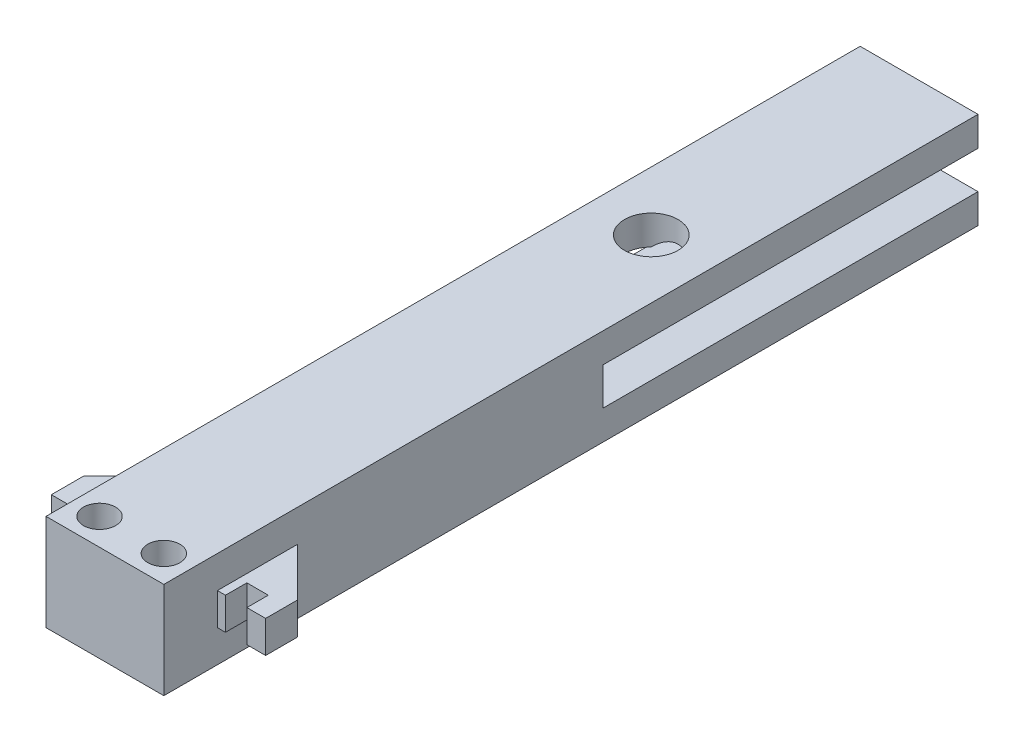
ISO-10303-21;
HEADER;
FILE_DESCRIPTION(('STEP AP214'),'2;1');
FILE_NAME('part.step','',(''),(''),'','','');
FILE_SCHEMA(('AUTOMOTIVE_DESIGN { 1 0 10303 214 1 1 1 1 }'));
ENDSEC;
DATA;
#1=APPLICATION_CONTEXT('core data for automotive mechanical design processes');
#2=APPLICATION_PROTOCOL_DEFINITION('international standard','automotive_design',2000,#1);
#3=PRODUCT_CONTEXT('',#1,'mechanical');
#4=PRODUCT('Part','Part','',(#3));
#5=PRODUCT_RELATED_PRODUCT_CATEGORY('part','',(#4));
#6=PRODUCT_DEFINITION_FORMATION('','',#4);
#7=PRODUCT_DEFINITION_CONTEXT('part definition',#1,'design');
#8=PRODUCT_DEFINITION('design','',#6,#7);
#9=PRODUCT_DEFINITION_SHAPE('','',#8);
#10=(LENGTH_UNIT() NAMED_UNIT(*) SI_UNIT(.MILLI.,.METRE.));
#11=(NAMED_UNIT(*) PLANE_ANGLE_UNIT() SI_UNIT($,.RADIAN.));
#12=(NAMED_UNIT(*) SI_UNIT($,.STERADIAN.) SOLID_ANGLE_UNIT());
#13=UNCERTAINTY_MEASURE_WITH_UNIT(LENGTH_MEASURE(1.E-05),#10,'distance_accuracy_value','');
#14=(GEOMETRIC_REPRESENTATION_CONTEXT(3) GLOBAL_UNCERTAINTY_ASSIGNED_CONTEXT((#13)) GLOBAL_UNIT_ASSIGNED_CONTEXT((#10,
#11,#12)) REPRESENTATION_CONTEXT('',''));
#15=CARTESIAN_POINT('',(0.,0.,0.));
#16=DIRECTION('',(0.,0.,1.));
#17=DIRECTION('',(1.,0.,0.));
#18=AXIS2_PLACEMENT_3D('',#15,#16,#17);
#19=CARTESIAN_POINT('',(0.,4.5,-42.9999999999999));
#20=DIRECTION('',(0.,0.,1.));
#21=DIRECTION('',(1.,0.,0.));
#22=AXIS2_PLACEMENT_3D('',#19,#20,#21);
#23=CYLINDRICAL_SURFACE('',#22,2.5);
#24=CARTESIAN_POINT('',(0.,4.5,-13.));
#25=DIRECTION('',(0.,0.707106781186547,0.707106781186547));
#26=DIRECTION('',(0.,0.707106781186547,-0.707106781186547));
#27=AXIS2_PLACEMENT_3D('',#24,#25,#26);
#28=ELLIPSE('',#27,3.53553390593274,2.5);
#29=CARTESIAN_POINT('',(1.78535710713579,6.24999999999992,-14.7499999999999));
#30=VERTEX_POINT('',#29);
#31=CARTESIAN_POINT('',(-1.78535710713579,6.24999999999992,-14.7499999999999));
#32=VERTEX_POINT('',#31);
#33=EDGE_CURVE('E62',#30,#32,#28,.T.);
#34=ORIENTED_EDGE('',*,*,#33,.T.);
#35=DIRECTION('',(0.,0.,1.));
#36=VECTOR('',#35,1.);
#37=CARTESIAN_POINT('',(-1.78535710713579,6.24999999999992,-42.9999999999999));
#38=LINE('',#37,#36);
#39=CARTESIAN_POINT('',(-1.78535710713579,6.24999999999992,-38.));
#40=VERTEX_POINT('',#39);
#41=EDGE_CURVE('E256',#40,#32,#38,.T.);
#42=ORIENTED_EDGE('',*,*,#41,.F.);
#43=CARTESIAN_POINT('',(0.,4.5,-38.));
#44=DIRECTION('',(0.,0.,1.));
#45=DIRECTION('',(1.,0.,0.));
#46=AXIS2_PLACEMENT_3D('',#43,#44,#45);
#47=CIRCLE('',#46,2.5);
#48=CARTESIAN_POINT('',(1.78535710713579,6.24999999999992,-38.));
#49=VERTEX_POINT('',#48);
#50=EDGE_CURVE('E342',#49,#40,#47,.T.);
#51=ORIENTED_EDGE('',*,*,#50,.F.);
#52=DIRECTION('',(0.,0.,1.));
#53=VECTOR('',#52,1.);
#54=CARTESIAN_POINT('',(1.78535710713579,6.24999999999992,-42.9999999999999));
#55=LINE('',#54,#53);
#56=EDGE_CURVE('E258',#30,#49,#55,.F.);
#57=ORIENTED_EDGE('',*,*,#56,.F.);
#58=EDGE_LOOP('',(#34,#42,#51,#57));
#59=FACE_BOUND('',#58,.T.);
#60=ADVANCED_FACE('F46',(#59),#23,.F.);
#61=CARTESIAN_POINT('',(-5.5,9.,-38.));
#62=DIRECTION('',(0.,0.,1.));
#63=DIRECTION('',(1.,0.,0.));
#64=AXIS2_PLACEMENT_3D('',#61,#62,#63);
#65=PLANE('',#64);
#66=DIRECTION('',(0.,-1.,0.));
#67=VECTOR('',#66,1.);
#68=CARTESIAN_POINT('',(-5.5,9.,-38.));
#69=LINE('',#68,#67);
#70=CARTESIAN_POINT('',(-5.5,2.75000000000008,-38.));
#71=VERTEX_POINT('',#70);
#72=CARTESIAN_POINT('',(-5.5,0.,-38.));
#73=VERTEX_POINT('',#72);
#74=EDGE_CURVE('E302',#71,#73,#69,.T.);
#75=ORIENTED_EDGE('',*,*,#74,.F.);
#76=DIRECTION('',(-1.,0.,0.));
#77=VECTOR('',#76,1.);
#78=CARTESIAN_POINT('',(5.5,2.75000000000008,-38.));
#79=LINE('',#78,#77);
#80=CARTESIAN_POINT('',(-1.78535710713579,2.75000000000008,-38.));
#81=VERTEX_POINT('',#80);
#82=EDGE_CURVE('E539',#81,#71,#79,.T.);
#83=ORIENTED_EDGE('',*,*,#82,.F.);
#84=CARTESIAN_POINT('',(1.78535710713579,2.75000000000008,-38.));
#85=VERTEX_POINT('',#84);
#86=EDGE_CURVE('E345',#81,#85,#47,.T.);
#87=ORIENTED_EDGE('',*,*,#86,.T.);
#88=CARTESIAN_POINT('',(5.5,2.75000000000008,-38.));
#89=VERTEX_POINT('',#88);
#90=EDGE_CURVE('E535',#89,#85,#79,.T.);
#91=ORIENTED_EDGE('',*,*,#90,.F.);
#92=DIRECTION('',(0.,-1.,0.));
#93=VECTOR('',#92,1.);
#94=CARTESIAN_POINT('',(5.5,9.,-38.));
#95=LINE('',#94,#93);
#96=CARTESIAN_POINT('',(5.5,0.,-38.));
#97=VERTEX_POINT('',#96);
#98=EDGE_CURVE('E293',#89,#97,#95,.T.);
#99=ORIENTED_EDGE('',*,*,#98,.T.);
#100=DIRECTION('',(-1.,0.,0.));
#101=VECTOR('',#100,1.);
#102=CARTESIAN_POINT('',(-5.5,0.,-38.));
#103=LINE('',#102,#101);
#104=EDGE_CURVE('E319',#97,#73,#103,.T.);
#105=ORIENTED_EDGE('',*,*,#104,.T.);
#106=EDGE_LOOP('',(#75,#83,#87,#91,#99,#105));
#107=FACE_BOUND('',#106,.T.);
#108=ADVANCED_FACE('F617',(#107),#65,.F.);
#109=CARTESIAN_POINT('',(10.,6.,33.));
#110=DIRECTION('',(0.,0.,1.));
#111=DIRECTION('',(1.,0.,0.));
#112=AXIS2_PLACEMENT_3D('',#109,#110,#111);
#113=PLANE('',#112);
#114=DIRECTION('',(-1.,0.,0.));
#115=VECTOR('',#114,1.);
#116=CARTESIAN_POINT('',(10.,6.,33.));
#117=LINE('',#116,#115);
#118=CARTESIAN_POINT('',(10.,6.,33.));
#119=VERTEX_POINT('',#118);
#120=CARTESIAN_POINT('',(8.25,6.,33.));
#121=VERTEX_POINT('',#120);
#122=EDGE_CURVE('E395',#119,#121,#117,.T.);
#123=ORIENTED_EDGE('',*,*,#122,.T.);
#124=DIRECTION('',(0.,-1.,0.));
#125=VECTOR('',#124,1.);
#126=CARTESIAN_POINT('',(8.25,6.,33.));
#127=LINE('',#126,#125);
#128=CARTESIAN_POINT('',(8.25,3.,33.));
#129=VERTEX_POINT('',#128);
#130=EDGE_CURVE('E473',#121,#129,#127,.T.);
#131=ORIENTED_EDGE('',*,*,#130,.T.);
#132=DIRECTION('',(-1.,0.,0.));
#133=VECTOR('',#132,1.);
#134=CARTESIAN_POINT('',(10.,3.,33.));
#135=LINE('',#134,#133);
#136=CARTESIAN_POINT('',(10.,3.,33.));
#137=VERTEX_POINT('',#136);
#138=EDGE_CURVE('E376',#137,#129,#135,.T.);
#139=ORIENTED_EDGE('',*,*,#138,.F.);
#140=DIRECTION('',(0.,1.,0.));
#141=VECTOR('',#140,1.);
#142=CARTESIAN_POINT('',(10.,6.,33.));
#143=LINE('',#142,#141);
#144=EDGE_CURVE('E403',#137,#119,#143,.T.);
#145=ORIENTED_EDGE('',*,*,#144,.T.);
#146=EDGE_LOOP('',(#123,#131,#139,#145));
#147=FACE_BOUND('',#146,.T.);
#148=ADVANCED_FACE('F658',(#147),#113,.T.);
#149=CARTESIAN_POINT('',(6.25,3.,33.));
#150=VERTEX_POINT('',#149);
#151=CARTESIAN_POINT('',(5.5,3.,33.));
#152=VERTEX_POINT('',#151);
#153=EDGE_CURVE('E394',#150,#152,#135,.T.);
#154=ORIENTED_EDGE('',*,*,#153,.F.);
#155=DIRECTION('',(0.,1.,0.));
#156=VECTOR('',#155,1.);
#157=CARTESIAN_POINT('',(6.25,6.,33.));
#158=LINE('',#157,#156);
#159=CARTESIAN_POINT('',(6.25,6.,33.));
#160=VERTEX_POINT('',#159);
#161=EDGE_CURVE('E485',#150,#160,#158,.T.);
#162=ORIENTED_EDGE('',*,*,#161,.T.);
#163=CARTESIAN_POINT('',(5.5,6.,33.));
#164=VERTEX_POINT('',#163);
#165=EDGE_CURVE('E399',#160,#164,#117,.T.);
#166=ORIENTED_EDGE('',*,*,#165,.T.);
#167=DIRECTION('',(0.,1.,0.));
#168=VECTOR('',#167,1.);
#169=CARTESIAN_POINT('',(5.5,6.,33.));
#170=LINE('',#169,#168);
#171=EDGE_CURVE('E408',#152,#164,#170,.T.);
#172=ORIENTED_EDGE('',*,*,#171,.F.);
#173=EDGE_LOOP('',(#154,#162,#166,#172));
#174=FACE_BOUND('',#173,.T.);
#175=ADVANCED_FACE('F730',(#174),#113,.T.);
#176=CARTESIAN_POINT('',(10.,3.,30.));
#177=DIRECTION('',(0.,-1.,0.));
#178=DIRECTION('',(0.,0.,-1.));
#179=AXIS2_PLACEMENT_3D('',#176,#177,#178);
#180=PLANE('',#179);
#181=ORIENTED_EDGE('',*,*,#138,.T.);
#182=DIRECTION('',(0.,0.,1.));
#183=VECTOR('',#182,1.);
#184=CARTESIAN_POINT('',(8.25,3.,26.394448724536));
#185=LINE('',#184,#183);
#186=CARTESIAN_POINT('',(8.25,3.,31.));
#187=VERTEX_POINT('',#186);
#188=EDGE_CURVE('E472',#187,#129,#185,.T.);
#189=ORIENTED_EDGE('',*,*,#188,.F.);
#190=DIRECTION('',(1.,0.,0.));
#191=VECTOR('',#190,1.);
#192=CARTESIAN_POINT('',(8.25,3.,31.));
#193=LINE('',#192,#191);
#194=CARTESIAN_POINT('',(6.25,3.,31.));
#195=VERTEX_POINT('',#194);
#196=EDGE_CURVE('E462',#195,#187,#193,.T.);
#197=ORIENTED_EDGE('',*,*,#196,.F.);
#198=DIRECTION('',(0.,0.,1.));
#199=VECTOR('',#198,1.);
#200=CARTESIAN_POINT('',(6.25,3.,26.394448724536));
#201=LINE('',#200,#199);
#202=EDGE_CURVE('E468',#195,#150,#201,.T.);
#203=ORIENTED_EDGE('',*,*,#202,.T.);
#204=ORIENTED_EDGE('',*,*,#153,.T.);
#205=DIRECTION('',(0.,0.,1.));
#206=VECTOR('',#205,1.);
#207=CARTESIAN_POINT('',(5.5,3.,30.));
#208=LINE('',#207,#206);
#209=CARTESIAN_POINT('',(5.5,3.,25.5));
#210=VERTEX_POINT('',#209);
#211=EDGE_CURVE('E404',#210,#152,#208,.T.);
#212=ORIENTED_EDGE('',*,*,#211,.F.);
#213=DIRECTION('',(-0.707106781186546,0.,-0.707106781186549));
#214=VECTOR('',#213,1.);
#215=CARTESIAN_POINT('',(10.,3.,30.));
#216=LINE('',#215,#214);
#217=CARTESIAN_POINT('',(10.,3.,30.));
#218=VERTEX_POINT('',#217);
#219=EDGE_CURVE('E506',#218,#210,#216,.T.);
#220=ORIENTED_EDGE('',*,*,#219,.F.);
#221=DIRECTION('',(0.,0.,1.));
#222=VECTOR('',#221,1.);
#223=CARTESIAN_POINT('',(10.,3.,30.));
#224=LINE('',#223,#222);
#225=EDGE_CURVE('E421',#218,#137,#224,.T.);
#226=ORIENTED_EDGE('',*,*,#225,.T.);
#227=EDGE_LOOP('',(#181,#189,#197,#203,#204,#212,#220,#226));
#228=FACE_BOUND('',#227,.T.);
#229=ADVANCED_FACE('F688',(#228),#180,.T.);
#230=CARTESIAN_POINT('',(10.,6.,30.));
#231=DIRECTION('',(0.,1.,0.));
#232=DIRECTION('',(0.,0.,1.));
#233=AXIS2_PLACEMENT_3D('',#230,#231,#232);
#234=PLANE('',#233);
#235=DIRECTION('',(-1.,0.,0.));
#236=VECTOR('',#235,1.);
#237=CARTESIAN_POINT('',(8.25,6.,31.));
#238=LINE('',#237,#236);
#239=CARTESIAN_POINT('',(8.25,6.,31.));
#240=VERTEX_POINT('',#239);
#241=CARTESIAN_POINT('',(6.25,6.,31.));
#242=VERTEX_POINT('',#241);
#243=EDGE_CURVE('E492',#240,#242,#238,.T.);
#244=ORIENTED_EDGE('',*,*,#243,.F.);
#245=DIRECTION('',(0.,0.,1.));
#246=VECTOR('',#245,1.);
#247=CARTESIAN_POINT('',(8.25,6.,26.394448724536));
#248=LINE('',#247,#246);
#249=EDGE_CURVE('E476',#240,#121,#248,.T.);
#250=ORIENTED_EDGE('',*,*,#249,.T.);
#251=ORIENTED_EDGE('',*,*,#122,.F.);
#252=DIRECTION('',(0.,0.,-1.));
#253=VECTOR('',#252,1.);
#254=CARTESIAN_POINT('',(10.,6.,30.));
#255=LINE('',#254,#253);
#256=CARTESIAN_POINT('',(10.,6.,30.));
#257=VERTEX_POINT('',#256);
#258=EDGE_CURVE('E413',#119,#257,#255,.T.);
#259=ORIENTED_EDGE('',*,*,#258,.T.);
#260=DIRECTION('',(0.707106781186546,0.,0.707106781186549));
#261=VECTOR('',#260,1.);
#262=CARTESIAN_POINT('',(10.,6.,30.));
#263=LINE('',#262,#261);
#264=CARTESIAN_POINT('',(5.5,6.,25.5));
#265=VERTEX_POINT('',#264);
#266=EDGE_CURVE('E517',#265,#257,#263,.T.);
#267=ORIENTED_EDGE('',*,*,#266,.F.);
#268=DIRECTION('',(0.,0.,-1.));
#269=VECTOR('',#268,1.);
#270=CARTESIAN_POINT('',(5.5,6.,30.));
#271=LINE('',#270,#269);
#272=EDGE_CURVE('E400',#164,#265,#271,.T.);
#273=ORIENTED_EDGE('',*,*,#272,.F.);
#274=ORIENTED_EDGE('',*,*,#165,.F.);
#275=DIRECTION('',(0.,0.,1.));
#276=VECTOR('',#275,1.);
#277=CARTESIAN_POINT('',(6.25,6.,26.394448724536));
#278=LINE('',#277,#276);
#279=EDGE_CURVE('E467',#242,#160,#278,.T.);
#280=ORIENTED_EDGE('',*,*,#279,.F.);
#281=EDGE_LOOP('',(#244,#250,#251,#259,#267,#273,#274,#280));
#282=FACE_BOUND('',#281,.T.);
#283=ADVANCED_FACE('F681',(#282),#234,.T.);
#284=CARTESIAN_POINT('',(-9.99999999999999,6.,33.));
#285=DIRECTION('',(0.,0.,-1.));
#286=DIRECTION('',(-1.,0.,0.));
#287=AXIS2_PLACEMENT_3D('',#284,#285,#286);
#288=PLANE('',#287);
#289=DIRECTION('',(1.,0.,0.));
#290=VECTOR('',#289,1.);
#291=CARTESIAN_POINT('',(-9.99999999999999,6.,33.));
#292=LINE('',#291,#290);
#293=CARTESIAN_POINT('',(-6.24999999999999,6.,33.));
#294=VERTEX_POINT('',#293);
#295=CARTESIAN_POINT('',(-5.49999999999999,6.,33.));
#296=VERTEX_POINT('',#295);
#297=EDGE_CURVE('E358',#294,#296,#292,.T.);
#298=ORIENTED_EDGE('',*,*,#297,.F.);
#299=DIRECTION('',(0.,1.,0.));
#300=VECTOR('',#299,1.);
#301=CARTESIAN_POINT('',(-6.24999999999999,6.,33.));
#302=LINE('',#301,#300);
#303=CARTESIAN_POINT('',(-6.24999999999999,3.,33.));
#304=VERTEX_POINT('',#303);
#305=EDGE_CURVE('E450',#304,#294,#302,.T.);
#306=ORIENTED_EDGE('',*,*,#305,.F.);
#307=DIRECTION('',(1.,0.,0.));
#308=VECTOR('',#307,1.);
#309=CARTESIAN_POINT('',(-9.99999999999999,3.,33.));
#310=LINE('',#309,#308);
#311=CARTESIAN_POINT('',(-5.49999999999999,3.,33.));
#312=VERTEX_POINT('',#311);
#313=EDGE_CURVE('E363',#304,#312,#310,.T.);
#314=ORIENTED_EDGE('',*,*,#313,.T.);
#315=DIRECTION('',(0.,1.,0.));
#316=VECTOR('',#315,1.);
#317=CARTESIAN_POINT('',(-5.49999999999999,6.,33.));
#318=LINE('',#317,#316);
#319=EDGE_CURVE('E372',#312,#296,#318,.T.);
#320=ORIENTED_EDGE('',*,*,#319,.T.);
#321=EDGE_LOOP('',(#298,#306,#314,#320));
#322=FACE_BOUND('',#321,.T.);
#323=ADVANCED_FACE('F671',(#322),#288,.F.);
#324=CARTESIAN_POINT('',(-5.5,9.,-38.));
#325=DIRECTION('',(1.,0.,0.));
#326=DIRECTION('',(0.,0.,-1.));
#327=AXIS2_PLACEMENT_3D('',#324,#325,#326);
#328=PLANE('',#327);
#329=DIRECTION('',(0.,1.,0.));
#330=VECTOR('',#329,1.);
#331=CARTESIAN_POINT('',(-5.5,6.24999999999992,-2.99999999999999));
#332=LINE('',#331,#330);
#333=CARTESIAN_POINT('',(-5.5,2.75000000000008,-2.99999999999999));
#334=VERTEX_POINT('',#333);
#335=CARTESIAN_POINT('',(-5.5,6.24999999999992,-2.99999999999999));
#336=VERTEX_POINT('',#335);
#337=EDGE_CURVE('E538',#334,#336,#332,.T.);
#338=ORIENTED_EDGE('',*,*,#337,.F.);
#339=DIRECTION('',(0.,0.,-1.));
#340=VECTOR('',#339,1.);
#341=CARTESIAN_POINT('',(-5.5,2.75000000000008,-2.99999999999999));
#342=LINE('',#341,#340);
#343=EDGE_CURVE('E521',#334,#71,#342,.T.);
#344=ORIENTED_EDGE('',*,*,#343,.T.);
#345=ORIENTED_EDGE('',*,*,#74,.T.);
#346=DIRECTION('',(0.,0.,1.));
#347=VECTOR('',#346,1.);
#348=CARTESIAN_POINT('',(-5.5,0.,-38.));
#349=LINE('',#348,#347);
#350=CARTESIAN_POINT('',(-5.49999999999999,0.,38.));
#351=VERTEX_POINT('',#350);
#352=EDGE_CURVE('E316',#73,#351,#349,.T.);
#353=ORIENTED_EDGE('',*,*,#352,.T.);
#354=DIRECTION('',(0.,-1.,0.));
#355=VECTOR('',#354,1.);
#356=CARTESIAN_POINT('',(-5.49999999999999,9.,38.));
#357=LINE('',#356,#355);
#358=CARTESIAN_POINT('',(-5.49999999999999,9.,38.));
#359=VERTEX_POINT('',#358);
#360=EDGE_CURVE('E303',#359,#351,#357,.T.);
#361=ORIENTED_EDGE('',*,*,#360,.F.);
#362=DIRECTION('',(0.,0.,1.));
#363=VECTOR('',#362,1.);
#364=CARTESIAN_POINT('',(-5.5,9.,-38.));
#365=LINE('',#364,#363);
#366=CARTESIAN_POINT('',(-5.5,9.,-38.));
#367=VERTEX_POINT('',#366);
#368=EDGE_CURVE('E330',#367,#359,#365,.T.);
#369=ORIENTED_EDGE('',*,*,#368,.F.);
#370=CARTESIAN_POINT('',(-5.5,6.24999999999992,-38.));
#371=VERTEX_POINT('',#370);
#372=EDGE_CURVE('E297',#367,#371,#69,.T.);
#373=ORIENTED_EDGE('',*,*,#372,.T.);
#374=DIRECTION('',(0.,0.,-1.));
#375=VECTOR('',#374,1.);
#376=CARTESIAN_POINT('',(-5.5,6.24999999999992,-2.99999999999999));
#377=LINE('',#376,#375);
#378=EDGE_CURVE('E522',#336,#371,#377,.T.);
#379=ORIENTED_EDGE('',*,*,#378,.F.);
#380=EDGE_LOOP('',(#338,#344,#345,#353,#361,#369,#373,#379));
#381=FACE_BOUND('',#380,.T.);
#382=DIRECTION('',(0.,1.,0.));
#383=VECTOR('',#382,1.);
#384=CARTESIAN_POINT('',(-5.5,-3.36396103067894,25.5));
#385=LINE('',#384,#383);
#386=CARTESIAN_POINT('',(-5.5,3.,25.5));
#387=VERTEX_POINT('',#386);
#388=CARTESIAN_POINT('',(-5.5,6.,25.5));
#389=VERTEX_POINT('',#388);
#390=EDGE_CURVE('E498',#387,#389,#385,.T.);
#391=ORIENTED_EDGE('',*,*,#390,.T.);
#392=DIRECTION('',(0.,0.,-1.));
#393=VECTOR('',#392,1.);
#394=CARTESIAN_POINT('',(-5.49999999999999,6.,30.));
#395=LINE('',#394,#393);
#396=EDGE_CURVE('E369',#296,#389,#395,.T.);
#397=ORIENTED_EDGE('',*,*,#396,.F.);
#398=ORIENTED_EDGE('',*,*,#319,.F.);
#399=DIRECTION('',(0.,0.,1.));
#400=VECTOR('',#399,1.);
#401=CARTESIAN_POINT('',(-5.49999999999999,3.,30.));
#402=LINE('',#401,#400);
#403=EDGE_CURVE('E364',#387,#312,#402,.T.);
#404=ORIENTED_EDGE('',*,*,#403,.F.);
#405=EDGE_LOOP('',(#391,#397,#398,#404));
#406=FACE_BOUND('',#405,.T.);
#407=ADVANCED_FACE('F610',(#381,#406),#328,.F.);
#408=CARTESIAN_POINT('',(5.5,9.,-38.));
#409=DIRECTION('',(-1.,0.,0.));
#410=DIRECTION('',(0.,0.,1.));
#411=AXIS2_PLACEMENT_3D('',#408,#409,#410);
#412=PLANE('',#411);
#413=ORIENTED_EDGE('',*,*,#98,.F.);
#414=DIRECTION('',(0.,0.,-1.));
#415=VECTOR('',#414,1.);
#416=CARTESIAN_POINT('',(5.5,2.75000000000008,-2.99999999999999));
#417=LINE('',#416,#415);
#418=CARTESIAN_POINT('',(5.5,2.75000000000008,-2.99999999999999));
#419=VERTEX_POINT('',#418);
#420=EDGE_CURVE('E529',#419,#89,#417,.T.);
#421=ORIENTED_EDGE('',*,*,#420,.F.);
#422=DIRECTION('',(0.,-1.,0.));
#423=VECTOR('',#422,1.);
#424=CARTESIAN_POINT('',(5.5,6.24999999999992,-2.99999999999999));
#425=LINE('',#424,#423);
#426=CARTESIAN_POINT('',(5.5,6.24999999999992,-2.99999999999999));
#427=VERTEX_POINT('',#426);
#428=EDGE_CURVE('E545',#427,#419,#425,.T.);
#429=ORIENTED_EDGE('',*,*,#428,.F.);
#430=DIRECTION('',(0.,0.,-1.));
#431=VECTOR('',#430,1.);
#432=CARTESIAN_POINT('',(5.5,6.24999999999992,-2.99999999999999));
#433=LINE('',#432,#431);
#434=CARTESIAN_POINT('',(5.5,6.24999999999992,-38.));
#435=VERTEX_POINT('',#434);
#436=EDGE_CURVE('E525',#427,#435,#433,.T.);
#437=ORIENTED_EDGE('',*,*,#436,.T.);
#438=CARTESIAN_POINT('',(5.5,9.,-38.));
#439=VERTEX_POINT('',#438);
#440=EDGE_CURVE('E289',#439,#435,#95,.T.);
#441=ORIENTED_EDGE('',*,*,#440,.F.);
#442=DIRECTION('',(0.,0.,-1.));
#443=VECTOR('',#442,1.);
#444=CARTESIAN_POINT('',(5.5,9.,-38.));
#445=LINE('',#444,#443);
#446=CARTESIAN_POINT('',(5.5,9.,38.));
#447=VERTEX_POINT('',#446);
#448=EDGE_CURVE('E315',#447,#439,#445,.T.);
#449=ORIENTED_EDGE('',*,*,#448,.F.);
#450=DIRECTION('',(0.,-1.,0.));
#451=VECTOR('',#450,1.);
#452=CARTESIAN_POINT('',(5.5,9.,38.));
#453=LINE('',#452,#451);
#454=CARTESIAN_POINT('',(5.5,0.,38.));
#455=VERTEX_POINT('',#454);
#456=EDGE_CURVE('E307',#447,#455,#453,.T.);
#457=ORIENTED_EDGE('',*,*,#456,.T.);
#458=DIRECTION('',(0.,0.,-1.));
#459=VECTOR('',#458,1.);
#460=CARTESIAN_POINT('',(5.5,0.,-38.));
#461=LINE('',#460,#459);
#462=EDGE_CURVE('E323',#455,#97,#461,.T.);
#463=ORIENTED_EDGE('',*,*,#462,.T.);
#464=EDGE_LOOP('',(#413,#421,#429,#437,#441,#449,#457,#463));
#465=FACE_BOUND('',#464,.T.);
#466=ORIENTED_EDGE('',*,*,#272,.T.);
#467=DIRECTION('',(0.,1.,0.));
#468=VECTOR('',#467,1.);
#469=CARTESIAN_POINT('',(5.50000000000001,-3.36396103067894,25.5));
#470=LINE('',#469,#468);
#471=EDGE_CURVE('E513',#210,#265,#470,.T.);
#472=ORIENTED_EDGE('',*,*,#471,.F.);
#473=ORIENTED_EDGE('',*,*,#211,.T.);
#474=ORIENTED_EDGE('',*,*,#171,.T.);
#475=EDGE_LOOP('',(#466,#472,#473,#474));
#476=FACE_BOUND('',#475,.T.);
#477=ADVANCED_FACE('F48',(#465,#476),#412,.F.);
#478=ORIENTED_EDGE('',*,*,#440,.T.);
#479=DIRECTION('',(1.,0.,0.));
#480=VECTOR('',#479,1.);
#481=CARTESIAN_POINT('',(5.5,6.24999999999992,-38.));
#482=LINE('',#481,#480);
#483=EDGE_CURVE('E260',#49,#435,#482,.T.);
#484=ORIENTED_EDGE('',*,*,#483,.F.);
#485=ORIENTED_EDGE('',*,*,#50,.T.);
#486=EDGE_CURVE('E264',#371,#40,#482,.T.);
#487=ORIENTED_EDGE('',*,*,#486,.F.);
#488=ORIENTED_EDGE('',*,*,#372,.F.);
#489=DIRECTION('',(-1.,0.,0.));
#490=VECTOR('',#489,1.);
#491=CARTESIAN_POINT('',(-5.5,9.,-38.));
#492=LINE('',#491,#490);
#493=EDGE_CURVE('E333',#439,#367,#492,.T.);
#494=ORIENTED_EDGE('',*,*,#493,.F.);
#495=EDGE_LOOP('',(#478,#484,#485,#487,#488,#494));
#496=FACE_BOUND('',#495,.T.);
#497=ADVANCED_FACE('F642',(#496),#65,.F.);
#498=CARTESIAN_POINT('',(-5.49999999999999,9.,38.));
#499=DIRECTION('',(0.,0.,-1.));
#500=DIRECTION('',(-1.,0.,0.));
#501=AXIS2_PLACEMENT_3D('',#498,#499,#500);
#502=PLANE('',#501);
#503=DIRECTION('',(1.,0.,0.));
#504=VECTOR('',#503,1.);
#505=CARTESIAN_POINT('',(-5.49999999999999,0.,38.));
#506=LINE('',#505,#504);
#507=EDGE_CURVE('E312',#351,#455,#506,.T.);
#508=ORIENTED_EDGE('',*,*,#507,.T.);
#509=ORIENTED_EDGE('',*,*,#456,.F.);
#510=DIRECTION('',(1.,0.,0.));
#511=VECTOR('',#510,1.);
#512=CARTESIAN_POINT('',(-5.49999999999999,9.,38.));
#513=LINE('',#512,#511);
#514=EDGE_CURVE('E311',#359,#447,#513,.T.);
#515=ORIENTED_EDGE('',*,*,#514,.F.);
#516=ORIENTED_EDGE('',*,*,#360,.T.);
#517=EDGE_LOOP('',(#508,#509,#515,#516));
#518=FACE_BOUND('',#517,.T.);
#519=ADVANCED_FACE('F605',(#518),#502,.F.);
#520=CARTESIAN_POINT('',(0.,9.,0.));
#521=DIRECTION('',(0.,1.,0.));
#522=DIRECTION('',(0.,0.,1.));
#523=AXIS2_PLACEMENT_3D('',#520,#521,#522);
#524=PLANE('',#523);
#525=CARTESIAN_POINT('',(-3.,9.,35.5));
#526=DIRECTION('',(0.,1.,0.));
#527=DIRECTION('',(0.,0.,1.));
#528=AXIS2_PLACEMENT_3D('',#525,#526,#527);
#529=CIRCLE('',#528,1.5);
#530=CARTESIAN_POINT('',(-3.,9.,37.));
#531=VERTEX_POINT('',#530);
#532=EDGE_CURVE('E572',#531,#531,#529,.F.);
#533=ORIENTED_EDGE('',*,*,#532,.T.);
#534=EDGE_LOOP('',(#533));
#535=FACE_BOUND('',#534,.T.);
#536=CARTESIAN_POINT('',(3.,9.,35.5));
#537=DIRECTION('',(0.,1.,0.));
#538=DIRECTION('',(0.,0.,1.));
#539=AXIS2_PLACEMENT_3D('',#536,#537,#538);
#540=CIRCLE('',#539,1.5);
#541=CARTESIAN_POINT('',(3.,9.,37.));
#542=VERTEX_POINT('',#541);
#543=EDGE_CURVE('E568',#542,#542,#540,.F.);
#544=ORIENTED_EDGE('',*,*,#543,.T.);
#545=EDGE_LOOP('',(#544));
#546=FACE_BOUND('',#545,.T.);
#547=CARTESIAN_POINT('',(0.,9.,-13.));
#548=DIRECTION('',(0.,1.,0.));
#549=DIRECTION('',(0.,0.,1.));
#550=AXIS2_PLACEMENT_3D('',#547,#548,#549);
#551=CIRCLE('',#550,2.5);
#552=CARTESIAN_POINT('',(0.,9.,-10.5));
#553=VERTEX_POINT('',#552);
#554=EDGE_CURVE('E556',#553,#553,#551,.T.);
#555=ORIENTED_EDGE('',*,*,#554,.F.);
#556=EDGE_LOOP('',(#555));
#557=FACE_BOUND('',#556,.T.);
#558=ORIENTED_EDGE('',*,*,#448,.T.);
#559=ORIENTED_EDGE('',*,*,#493,.T.);
#560=ORIENTED_EDGE('',*,*,#368,.T.);
#561=ORIENTED_EDGE('',*,*,#514,.T.);
#562=EDGE_LOOP('',(#558,#559,#560,#561));
#563=FACE_BOUND('',#562,.T.);
#564=ADVANCED_FACE('F586',(#535,#546,#557,#563),#524,.T.);
#565=CARTESIAN_POINT('',(0.,0.,0.));
#566=DIRECTION('',(0.,1.,0.));
#567=DIRECTION('',(0.,0.,1.));
#568=AXIS2_PLACEMENT_3D('',#565,#566,#567);
#569=PLANE('',#568);
#570=CARTESIAN_POINT('',(-3.,0.,35.5));
#571=DIRECTION('',(0.,-1.,0.));
#572=DIRECTION('',(0.,0.,-1.));
#573=AXIS2_PLACEMENT_3D('',#570,#571,#572);
#574=CIRCLE('',#573,1.5);
#575=CARTESIAN_POINT('',(-3.,0.,34.));
#576=VERTEX_POINT('',#575);
#577=EDGE_CURVE('E250',#576,#576,#574,.T.);
#578=ORIENTED_EDGE('',*,*,#577,.F.);
#579=EDGE_LOOP('',(#578));
#580=FACE_BOUND('',#579,.T.);
#581=CARTESIAN_POINT('',(3.,0.,35.5));
#582=DIRECTION('',(0.,-1.,0.));
#583=DIRECTION('',(0.,0.,1.));
#584=AXIS2_PLACEMENT_3D('',#581,#582,#583);
#585=CIRCLE('',#584,1.5);
#586=CARTESIAN_POINT('',(3.,0.,37.));
#587=VERTEX_POINT('',#586);
#588=EDGE_CURVE('E564',#587,#587,#585,.T.);
#589=ORIENTED_EDGE('',*,*,#588,.F.);
#590=EDGE_LOOP('',(#589));
#591=FACE_BOUND('',#590,.T.);
#592=CARTESIAN_POINT('',(0.,0.,31.));
#593=DIRECTION('',(0.,1.,0.));
#594=DIRECTION('',(0.,0.,1.));
#595=AXIS2_PLACEMENT_3D('',#592,#593,#594);
#596=CIRCLE('',#595,2.5);
#597=CARTESIAN_POINT('',(0.,0.,33.5));
#598=VERTEX_POINT('',#597);
#599=EDGE_CURVE('E327',#598,#598,#596,.T.);
#600=ORIENTED_EDGE('',*,*,#599,.T.);
#601=EDGE_LOOP('',(#600));
#602=FACE_BOUND('',#601,.T.);
#603=ORIENTED_EDGE('',*,*,#462,.F.);
#604=ORIENTED_EDGE('',*,*,#507,.F.);
#605=ORIENTED_EDGE('',*,*,#352,.F.);
#606=ORIENTED_EDGE('',*,*,#104,.F.);
#607=EDGE_LOOP('',(#603,#604,#605,#606));
#608=FACE_BOUND('',#607,.T.);
#609=ADVANCED_FACE('F582',(#580,#591,#602,#608),#569,.F.);
#610=CARTESIAN_POINT('',(0.,4.5,-13.));
#611=DIRECTION('',(0.,0.707106781186547,-0.707106781186547));
#612=DIRECTION('',(0.,0.707106781186547,0.707106781186547));
#613=AXIS2_PLACEMENT_3D('',#610,#611,#612);
#614=ELLIPSE('',#613,3.53553390593274,2.5);
#615=CARTESIAN_POINT('',(-1.78535710713579,6.24999999999992,-11.2500000000001));
#616=VERTEX_POINT('',#615);
#617=CARTESIAN_POINT('',(1.78535710713579,6.24999999999992,-11.2500000000001));
#618=VERTEX_POINT('',#617);
#619=EDGE_CURVE('E244',#616,#618,#614,.T.);
#620=ORIENTED_EDGE('',*,*,#619,.T.);
#621=CARTESIAN_POINT('',(1.7853571071358,6.24999999999992,-2.99999999999999));
#622=VERTEX_POINT('',#621);
#623=EDGE_CURVE('E55',#622,#618,#55,.F.);
#624=ORIENTED_EDGE('',*,*,#623,.F.);
#625=CARTESIAN_POINT('',(0.,4.5,-2.99999999999999));
#626=DIRECTION('',(0.,0.,-1.));
#627=DIRECTION('',(-1.,0.,0.));
#628=AXIS2_PLACEMENT_3D('',#625,#626,#627);
#629=CIRCLE('',#628,2.5);
#630=CARTESIAN_POINT('',(1.78535710713579,2.75000000000008,-2.99999999999999));
#631=VERTEX_POINT('',#630);
#632=EDGE_CURVE('E271',#622,#631,#629,.T.);
#633=ORIENTED_EDGE('',*,*,#632,.T.);
#634=DIRECTION('',(0.,0.,1.));
#635=VECTOR('',#634,1.);
#636=CARTESIAN_POINT('',(1.78535710713579,2.75000000000008,-42.9999999999999));
#637=LINE('',#636,#635);
#638=EDGE_CURVE('E12',#85,#631,#637,.T.);
#639=ORIENTED_EDGE('',*,*,#638,.F.);
#640=ORIENTED_EDGE('',*,*,#86,.F.);
#641=DIRECTION('',(0.,0.,1.));
#642=VECTOR('',#641,1.);
#643=CARTESIAN_POINT('',(-1.78535710713579,2.75000000000008,-42.9999999999999));
#644=LINE('',#643,#642);
#645=CARTESIAN_POINT('',(-1.78535710713579,2.75000000000008,-2.99999999999999));
#646=VERTEX_POINT('',#645);
#647=EDGE_CURVE('E266',#646,#81,#644,.F.);
#648=ORIENTED_EDGE('',*,*,#647,.F.);
#649=CARTESIAN_POINT('',(-1.78535710713579,6.24999999999992,-2.99999999999999));
#650=VERTEX_POINT('',#649);
#651=EDGE_CURVE('E273',#646,#650,#629,.T.);
#652=ORIENTED_EDGE('',*,*,#651,.T.);
#653=EDGE_CURVE('E267',#616,#650,#38,.T.);
#654=ORIENTED_EDGE('',*,*,#653,.F.);
#655=EDGE_LOOP('',(#620,#624,#633,#639,#640,#648,#652,#654));
#656=FACE_BOUND('',#655,.T.);
#657=CARTESIAN_POINT('',(0.,4.5,27.));
#658=DIRECTION('',(0.,0.,-1.));
#659=DIRECTION('',(-1.,0.,0.));
#660=AXIS2_PLACEMENT_3D('',#657,#658,#659);
#661=CIRCLE('',#660,2.5);
#662=CARTESIAN_POINT('',(0.,7.,27.));
#663=VERTEX_POINT('',#662);
#664=EDGE_CURVE('E350',#663,#663,#661,.T.);
#665=ORIENTED_EDGE('',*,*,#664,.F.);
#666=EDGE_LOOP('',(#665));
#667=FACE_BOUND('',#666,.T.);
#668=ADVANCED_FACE('F585',(#656,#667),#23,.F.);
#669=CARTESIAN_POINT('',(0.,0.5,27.));
#670=DIRECTION('',(1.,0.,0.));
#671=DIRECTION('',(0.,0.,-1.));
#672=AXIS2_PLACEMENT_3D('',#669,#670,#671);
#673=TOROIDAL_SURFACE('',#672,4.,2.5);
#674=CARTESIAN_POINT('',(0.,0.5,31.));
#675=DIRECTION('',(0.,1.,0.));
#676=DIRECTION('',(-1.,0.,0.));
#677=AXIS2_PLACEMENT_3D('',#674,#675,#676);
#678=CIRCLE('',#677,2.5);
#679=CARTESIAN_POINT('',(0.,0.500000000000001,33.5));
#680=VERTEX_POINT('',#679);
#681=EDGE_CURVE('E346',#680,#680,#678,.T.);
#682=CARTESIAN_POINT('',(0.,0.5,27.));
#683=DIRECTION('',(1.,0.,0.));
#684=DIRECTION('',(0.,0.,-1.));
#685=AXIS2_PLACEMENT_3D('',#682,#683,#684);
#686=CIRCLE('',#685,6.5);
#687=EDGE_CURVE('',#663,#680,#686,.T.);
#688=ORIENTED_EDGE('',*,*,#664,.T.);
#689=ORIENTED_EDGE('',*,*,#681,.F.);
#690=ORIENTED_EDGE('',*,*,#687,.T.);
#691=ORIENTED_EDGE('',*,*,#687,.F.);
#692=EDGE_LOOP('',(#688,#690,#689,#691));
#693=FACE_BOUND('',#692,.T.);
#694=ADVANCED_FACE('F662',(#693),#673,.F.);
#695=CARTESIAN_POINT('',(0.,0.5,31.));
#696=DIRECTION('',(0.,-1.,0.));
#697=DIRECTION('',(0.,0.,-1.));
#698=AXIS2_PLACEMENT_3D('',#695,#696,#697);
#699=CYLINDRICAL_SURFACE('',#698,2.5);
#700=ORIENTED_EDGE('',*,*,#599,.F.);
#701=EDGE_LOOP('',(#700));
#702=FACE_BOUND('',#701,.T.);
#703=ORIENTED_EDGE('',*,*,#681,.T.);
#704=EDGE_LOOP('',(#703));
#705=FACE_BOUND('',#704,.T.);
#706=ADVANCED_FACE('F588',(#702,#705),#699,.F.);
#707=CARTESIAN_POINT('',(-9.99999999999999,3.,33.));
#708=VERTEX_POINT('',#707);
#709=CARTESIAN_POINT('',(-8.24999999999999,3.,33.));
#710=VERTEX_POINT('',#709);
#711=EDGE_CURVE('E359',#708,#710,#310,.T.);
#712=ORIENTED_EDGE('',*,*,#711,.T.);
#713=DIRECTION('',(0.,-1.,0.));
#714=VECTOR('',#713,1.);
#715=CARTESIAN_POINT('',(-8.24999999999999,6.,33.));
#716=LINE('',#715,#714);
#717=CARTESIAN_POINT('',(-8.24999999999999,6.,33.));
#718=VERTEX_POINT('',#717);
#719=EDGE_CURVE('E437',#718,#710,#716,.T.);
#720=ORIENTED_EDGE('',*,*,#719,.F.);
#721=CARTESIAN_POINT('',(-9.99999999999999,6.,33.));
#722=VERTEX_POINT('',#721);
#723=EDGE_CURVE('E354',#722,#718,#292,.T.);
#724=ORIENTED_EDGE('',*,*,#723,.F.);
#725=DIRECTION('',(0.,1.,0.));
#726=VECTOR('',#725,1.);
#727=CARTESIAN_POINT('',(-9.99999999999999,6.,33.));
#728=LINE('',#727,#726);
#729=EDGE_CURVE('E368',#708,#722,#728,.T.);
#730=ORIENTED_EDGE('',*,*,#729,.F.);
#731=EDGE_LOOP('',(#712,#720,#724,#730));
#732=FACE_BOUND('',#731,.T.);
#733=ADVANCED_FACE('F663',(#732),#288,.F.);
#734=CARTESIAN_POINT('',(-9.99999999999999,6.,30.));
#735=DIRECTION('',(0.,-1.,0.));
#736=DIRECTION('',(0.,0.,-1.));
#737=AXIS2_PLACEMENT_3D('',#734,#735,#736);
#738=PLANE('',#737);
#739=DIRECTION('',(1.,0.,0.));
#740=VECTOR('',#739,1.);
#741=CARTESIAN_POINT('',(-8.24999999999999,6.,31.));
#742=LINE('',#741,#740);
#743=CARTESIAN_POINT('',(-8.24999999999999,6.,31.));
#744=VERTEX_POINT('',#743);
#745=CARTESIAN_POINT('',(-6.24999999999999,6.,31.));
#746=VERTEX_POINT('',#745);
#747=EDGE_CURVE('E412',#744,#746,#742,.T.);
#748=ORIENTED_EDGE('',*,*,#747,.T.);
#749=DIRECTION('',(0.,0.,1.));
#750=VECTOR('',#749,1.);
#751=CARTESIAN_POINT('',(-6.24999999999999,6.,26.394448724536));
#752=LINE('',#751,#750);
#753=EDGE_CURVE('E432',#746,#294,#752,.T.);
#754=ORIENTED_EDGE('',*,*,#753,.T.);
#755=ORIENTED_EDGE('',*,*,#297,.T.);
#756=ORIENTED_EDGE('',*,*,#396,.T.);
#757=DIRECTION('',(-0.707106781186546,0.,0.707106781186549));
#758=VECTOR('',#757,1.);
#759=CARTESIAN_POINT('',(-9.99999999999999,6.,30.));
#760=LINE('',#759,#758);
#761=CARTESIAN_POINT('',(-9.99999999999999,6.,30.));
#762=VERTEX_POINT('',#761);
#763=EDGE_CURVE('E502',#389,#762,#760,.T.);
#764=ORIENTED_EDGE('',*,*,#763,.T.);
#765=DIRECTION('',(0.,0.,-1.));
#766=VECTOR('',#765,1.);
#767=CARTESIAN_POINT('',(-9.99999999999999,6.,30.));
#768=LINE('',#767,#766);
#769=EDGE_CURVE('E384',#722,#762,#768,.T.);
#770=ORIENTED_EDGE('',*,*,#769,.F.);
#771=ORIENTED_EDGE('',*,*,#723,.T.);
#772=DIRECTION('',(0.,0.,1.));
#773=VECTOR('',#772,1.);
#774=CARTESIAN_POINT('',(-8.24999999999999,6.,26.394448724536));
#775=LINE('',#774,#773);
#776=EDGE_CURVE('E436',#744,#718,#775,.T.);
#777=ORIENTED_EDGE('',*,*,#776,.F.);
#778=EDGE_LOOP('',(#748,#754,#755,#756,#764,#770,#771,#777));
#779=FACE_BOUND('',#778,.T.);
#780=ADVANCED_FACE('F669',(#779),#738,.F.);
#781=CARTESIAN_POINT('',(-9.99999999999999,3.,30.));
#782=DIRECTION('',(0.,1.,0.));
#783=DIRECTION('',(0.,0.,1.));
#784=AXIS2_PLACEMENT_3D('',#781,#782,#783);
#785=PLANE('',#784);
#786=ORIENTED_EDGE('',*,*,#313,.F.);
#787=DIRECTION('',(0.,0.,1.));
#788=VECTOR('',#787,1.);
#789=CARTESIAN_POINT('',(-6.24999999999999,3.,26.394448724536));
#790=LINE('',#789,#788);
#791=CARTESIAN_POINT('',(-6.24999999999999,3.,31.));
#792=VERTEX_POINT('',#791);
#793=EDGE_CURVE('E444',#792,#304,#790,.T.);
#794=ORIENTED_EDGE('',*,*,#793,.F.);
#795=DIRECTION('',(-1.,0.,0.));
#796=VECTOR('',#795,1.);
#797=CARTESIAN_POINT('',(-8.24999999999999,3.,31.));
#798=LINE('',#797,#796);
#799=CARTESIAN_POINT('',(-8.24999999999999,3.,31.));
#800=VERTEX_POINT('',#799);
#801=EDGE_CURVE('E456',#792,#800,#798,.T.);
#802=ORIENTED_EDGE('',*,*,#801,.T.);
#803=DIRECTION('',(0.,0.,1.));
#804=VECTOR('',#803,1.);
#805=CARTESIAN_POINT('',(-8.24999999999999,3.,26.394448724536));
#806=LINE('',#805,#804);
#807=EDGE_CURVE('E440',#800,#710,#806,.T.);
#808=ORIENTED_EDGE('',*,*,#807,.T.);
#809=ORIENTED_EDGE('',*,*,#711,.F.);
#810=DIRECTION('',(0.,0.,1.));
#811=VECTOR('',#810,1.);
#812=CARTESIAN_POINT('',(-9.99999999999999,3.,30.));
#813=LINE('',#812,#811);
#814=CARTESIAN_POINT('',(-9.99999999999999,3.,30.));
#815=VERTEX_POINT('',#814);
#816=EDGE_CURVE('E377',#815,#708,#813,.T.);
#817=ORIENTED_EDGE('',*,*,#816,.F.);
#818=DIRECTION('',(0.707106781186546,0.,-0.707106781186549));
#819=VECTOR('',#818,1.);
#820=CARTESIAN_POINT('',(-9.99999999999999,3.,30.));
#821=LINE('',#820,#819);
#822=EDGE_CURVE('E489',#815,#387,#821,.T.);
#823=ORIENTED_EDGE('',*,*,#822,.T.);
#824=ORIENTED_EDGE('',*,*,#403,.T.);
#825=EDGE_LOOP('',(#786,#794,#802,#808,#809,#817,#823,#824));
#826=FACE_BOUND('',#825,.T.);
#827=ADVANCED_FACE('F676',(#826),#785,.F.);
#828=CARTESIAN_POINT('',(-10.,0.,0.));
#829=DIRECTION('',(-1.,0.,0.));
#830=DIRECTION('',(0.,0.,1.));
#831=AXIS2_PLACEMENT_3D('',#828,#829,#830);
#832=PLANE('',#831);
#833=ORIENTED_EDGE('',*,*,#729,.T.);
#834=ORIENTED_EDGE('',*,*,#769,.T.);
#835=DIRECTION('',(0.,-1.,0.));
#836=VECTOR('',#835,1.);
#837=CARTESIAN_POINT('',(-9.99999999999999,6.,30.));
#838=LINE('',#837,#836);
#839=EDGE_CURVE('E380',#762,#815,#838,.T.);
#840=ORIENTED_EDGE('',*,*,#839,.T.);
#841=ORIENTED_EDGE('',*,*,#816,.T.);
#842=EDGE_LOOP('',(#833,#834,#840,#841));
#843=FACE_BOUND('',#842,.T.);
#844=ADVANCED_FACE('F702',(#843),#832,.T.);
#845=CARTESIAN_POINT('',(10.,0.,0.));
#846=DIRECTION('',(1.,0.,0.));
#847=DIRECTION('',(0.,0.,1.));
#848=AXIS2_PLACEMENT_3D('',#845,#846,#847);
#849=PLANE('',#848);
#850=ORIENTED_EDGE('',*,*,#144,.F.);
#851=ORIENTED_EDGE('',*,*,#225,.F.);
#852=DIRECTION('',(0.,-1.,0.));
#853=VECTOR('',#852,1.);
#854=CARTESIAN_POINT('',(10.,6.,30.));
#855=LINE('',#854,#853);
#856=EDGE_CURVE('E417',#257,#218,#855,.T.);
#857=ORIENTED_EDGE('',*,*,#856,.F.);
#858=ORIENTED_EDGE('',*,*,#258,.F.);
#859=EDGE_LOOP('',(#850,#851,#857,#858));
#860=FACE_BOUND('',#859,.T.);
#861=ADVANCED_FACE('F725',(#860),#849,.T.);
#862=CARTESIAN_POINT('',(-6.24999999999999,6.,26.394448724536));
#863=DIRECTION('',(1.,0.,0.));
#864=DIRECTION('',(0.,1.,0.));
#865=AXIS2_PLACEMENT_3D('',#862,#863,#864);
#866=PLANE('',#865);
#867=DIRECTION('',(0.,-1.,0.));
#868=VECTOR('',#867,1.);
#869=CARTESIAN_POINT('',(-6.24999999999999,6.,31.));
#870=LINE('',#869,#868);
#871=EDGE_CURVE('E431',#746,#792,#870,.T.);
#872=ORIENTED_EDGE('',*,*,#871,.T.);
#873=ORIENTED_EDGE('',*,*,#793,.T.);
#874=ORIENTED_EDGE('',*,*,#305,.T.);
#875=ORIENTED_EDGE('',*,*,#753,.F.);
#876=EDGE_LOOP('',(#872,#873,#874,#875));
#877=FACE_BOUND('',#876,.T.);
#878=ADVANCED_FACE('F718',(#877),#866,.F.);
#879=CARTESIAN_POINT('',(-8.24999999999999,6.,26.394448724536));
#880=DIRECTION('',(-1.,0.,0.));
#881=DIRECTION('',(0.,0.,1.));
#882=AXIS2_PLACEMENT_3D('',#879,#880,#881);
#883=PLANE('',#882);
#884=DIRECTION('',(0.,1.,0.));
#885=VECTOR('',#884,1.);
#886=CARTESIAN_POINT('',(-8.24999999999999,6.,31.));
#887=LINE('',#886,#885);
#888=EDGE_CURVE('E447',#800,#744,#887,.T.);
#889=ORIENTED_EDGE('',*,*,#888,.T.);
#890=ORIENTED_EDGE('',*,*,#776,.T.);
#891=ORIENTED_EDGE('',*,*,#719,.T.);
#892=ORIENTED_EDGE('',*,*,#807,.F.);
#893=EDGE_LOOP('',(#889,#890,#891,#892));
#894=FACE_BOUND('',#893,.T.);
#895=ADVANCED_FACE('F711',(#894),#883,.F.);
#896=CARTESIAN_POINT('',(-9.99999999999999,6.,31.));
#897=DIRECTION('',(0.,0.,1.));
#898=DIRECTION('',(1.,0.,0.));
#899=AXIS2_PLACEMENT_3D('',#896,#897,#898);
#900=PLANE('',#899);
#901=ORIENTED_EDGE('',*,*,#871,.F.);
#902=ORIENTED_EDGE('',*,*,#747,.F.);
#903=ORIENTED_EDGE('',*,*,#888,.F.);
#904=ORIENTED_EDGE('',*,*,#801,.F.);
#905=EDGE_LOOP('',(#901,#902,#903,#904));
#906=FACE_BOUND('',#905,.T.);
#907=ADVANCED_FACE('F715',(#906),#900,.T.);
#908=CARTESIAN_POINT('',(8.25,6.,26.394448724536));
#909=DIRECTION('',(-1.,0.,0.));
#910=DIRECTION('',(0.,0.,1.));
#911=AXIS2_PLACEMENT_3D('',#908,#909,#910);
#912=PLANE('',#911);
#913=ORIENTED_EDGE('',*,*,#188,.T.);
#914=ORIENTED_EDGE('',*,*,#130,.F.);
#915=ORIENTED_EDGE('',*,*,#249,.F.);
#916=DIRECTION('',(0.,1.,0.));
#917=VECTOR('',#916,1.);
#918=CARTESIAN_POINT('',(8.25,6.,31.));
#919=LINE('',#918,#917);
#920=EDGE_CURVE('E466',#187,#240,#919,.T.);
#921=ORIENTED_EDGE('',*,*,#920,.F.);
#922=EDGE_LOOP('',(#913,#914,#915,#921));
#923=FACE_BOUND('',#922,.T.);
#924=ADVANCED_FACE('F744',(#923),#912,.T.);
#925=CARTESIAN_POINT('',(6.25,6.,26.394448724536));
#926=DIRECTION('',(1.,0.,0.));
#927=DIRECTION('',(0.,1.,0.));
#928=AXIS2_PLACEMENT_3D('',#925,#926,#927);
#929=PLANE('',#928);
#930=ORIENTED_EDGE('',*,*,#279,.T.);
#931=ORIENTED_EDGE('',*,*,#161,.F.);
#932=ORIENTED_EDGE('',*,*,#202,.F.);
#933=DIRECTION('',(0.,-1.,0.));
#934=VECTOR('',#933,1.);
#935=CARTESIAN_POINT('',(6.25,6.,31.));
#936=LINE('',#935,#934);
#937=EDGE_CURVE('E453',#242,#195,#936,.T.);
#938=ORIENTED_EDGE('',*,*,#937,.F.);
#939=EDGE_LOOP('',(#930,#931,#932,#938));
#940=FACE_BOUND('',#939,.T.);
#941=ADVANCED_FACE('F745',(#940),#929,.T.);
#942=CARTESIAN_POINT('',(-9.99999999999999,6.,31.));
#943=DIRECTION('',(0.,0.,1.));
#944=DIRECTION('',(1.,0.,0.));
#945=AXIS2_PLACEMENT_3D('',#942,#943,#944);
#946=PLANE('',#945);
#947=ORIENTED_EDGE('',*,*,#243,.T.);
#948=ORIENTED_EDGE('',*,*,#937,.T.);
#949=ORIENTED_EDGE('',*,*,#196,.T.);
#950=ORIENTED_EDGE('',*,*,#920,.T.);
#951=EDGE_LOOP('',(#947,#948,#949,#950));
#952=FACE_BOUND('',#951,.T.);
#953=ADVANCED_FACE('F748',(#952),#946,.T.);
#954=CARTESIAN_POINT('',(-9.99999999999999,-3.36396103067894,30.));
#955=DIRECTION('',(-0.707106781186549,0.,-0.707106781186546));
#956=DIRECTION('',(-0.707106781186546,0.,0.707106781186549));
#957=AXIS2_PLACEMENT_3D('',#954,#955,#956);
#958=PLANE('',#957);
#959=ORIENTED_EDGE('',*,*,#822,.F.);
#960=ORIENTED_EDGE('',*,*,#839,.F.);
#961=ORIENTED_EDGE('',*,*,#763,.F.);
#962=ORIENTED_EDGE('',*,*,#390,.F.);
#963=EDGE_LOOP('',(#959,#960,#961,#962));
#964=FACE_BOUND('',#963,.T.);
#965=ADVANCED_FACE('F700',(#964),#958,.T.);
#966=CARTESIAN_POINT('',(10.,-3.36396103067894,30.));
#967=DIRECTION('',(-0.707106781186549,0.,0.707106781186546));
#968=DIRECTION('',(0.707106781186546,0.,0.707106781186549));
#969=AXIS2_PLACEMENT_3D('',#966,#967,#968);
#970=PLANE('',#969);
#971=ORIENTED_EDGE('',*,*,#856,.T.);
#972=ORIENTED_EDGE('',*,*,#219,.T.);
#973=ORIENTED_EDGE('',*,*,#471,.T.);
#974=ORIENTED_EDGE('',*,*,#266,.T.);
#975=EDGE_LOOP('',(#971,#972,#973,#974));
#976=FACE_BOUND('',#975,.T.);
#977=ADVANCED_FACE('F758',(#976),#970,.F.);
#978=CARTESIAN_POINT('',(0.,0.,-2.99999999999999));
#979=DIRECTION('',(0.,0.,-1.));
#980=DIRECTION('',(-1.,0.,0.));
#981=AXIS2_PLACEMENT_3D('',#978,#979,#980);
#982=PLANE('',#981);
#983=DIRECTION('',(-1.,0.,0.));
#984=VECTOR('',#983,1.);
#985=CARTESIAN_POINT('',(5.5,2.75000000000008,-2.99999999999999));
#986=LINE('',#985,#984);
#987=EDGE_CURVE('E544',#646,#334,#986,.T.);
#988=ORIENTED_EDGE('',*,*,#987,.T.);
#989=ORIENTED_EDGE('',*,*,#337,.T.);
#990=DIRECTION('',(1.,0.,0.));
#991=VECTOR('',#990,1.);
#992=CARTESIAN_POINT('',(5.5,6.24999999999992,-2.99999999999999));
#993=LINE('',#992,#991);
#994=EDGE_CURVE('E548',#336,#650,#993,.T.);
#995=ORIENTED_EDGE('',*,*,#994,.T.);
#996=ORIENTED_EDGE('',*,*,#651,.F.);
#997=EDGE_LOOP('',(#988,#989,#995,#996));
#998=FACE_BOUND('',#997,.T.);
#999=ADVANCED_FACE('F638',(#998),#982,.T.);
#1000=CARTESIAN_POINT('',(5.5,6.24999999999992,-2.99999999999999));
#1001=DIRECTION('',(0.,1.,0.));
#1002=DIRECTION('',(0.,0.,1.));
#1003=AXIS2_PLACEMENT_3D('',#1000,#1001,#1002);
#1004=PLANE('',#1003);
#1005=ORIENTED_EDGE('',*,*,#41,.T.);
#1006=CARTESIAN_POINT('',(0.,6.24999999999992,-13.));
#1007=DIRECTION('',(0.,1.,0.));
#1008=DIRECTION('',(0.,0.,1.));
#1009=AXIS2_PLACEMENT_3D('',#1006,#1007,#1008);
#1010=CIRCLE('',#1009,2.5);
#1011=EDGE_CURVE('E241',#616,#32,#1010,.F.);
#1012=ORIENTED_EDGE('',*,*,#1011,.F.);
#1013=ORIENTED_EDGE('',*,*,#653,.T.);
#1014=ORIENTED_EDGE('',*,*,#994,.F.);
#1015=ORIENTED_EDGE('',*,*,#378,.T.);
#1016=ORIENTED_EDGE('',*,*,#486,.T.);
#1017=EDGE_LOOP('',(#1005,#1012,#1013,#1014,#1015,#1016));
#1018=FACE_BOUND('',#1017,.T.);
#1019=ADVANCED_FACE('F262',(#1018),#1004,.F.);
#1020=CARTESIAN_POINT('',(5.5,2.75000000000008,-2.99999999999999));
#1021=DIRECTION('',(0.,-1.,0.));
#1022=DIRECTION('',(0.,0.,-1.));
#1023=AXIS2_PLACEMENT_3D('',#1020,#1021,#1022);
#1024=PLANE('',#1023);
#1025=ORIENTED_EDGE('',*,*,#647,.T.);
#1026=ORIENTED_EDGE('',*,*,#82,.T.);
#1027=ORIENTED_EDGE('',*,*,#343,.F.);
#1028=ORIENTED_EDGE('',*,*,#987,.F.);
#1029=EDGE_LOOP('',(#1025,#1026,#1027,#1028));
#1030=FACE_BOUND('',#1029,.T.);
#1031=ADVANCED_FACE('F764',(#1030),#1024,.F.);
#1032=ORIENTED_EDGE('',*,*,#638,.T.);
#1033=EDGE_CURVE('E70',#419,#631,#986,.T.);
#1034=ORIENTED_EDGE('',*,*,#1033,.F.);
#1035=ORIENTED_EDGE('',*,*,#420,.T.);
#1036=ORIENTED_EDGE('',*,*,#90,.T.);
#1037=EDGE_LOOP('',(#1032,#1034,#1035,#1036));
#1038=FACE_BOUND('',#1037,.T.);
#1039=ADVANCED_FACE('F622',(#1038),#1024,.F.);
#1040=EDGE_CURVE('E552',#622,#427,#993,.T.);
#1041=ORIENTED_EDGE('',*,*,#1040,.T.);
#1042=ORIENTED_EDGE('',*,*,#428,.T.);
#1043=ORIENTED_EDGE('',*,*,#1033,.T.);
#1044=ORIENTED_EDGE('',*,*,#632,.F.);
#1045=EDGE_LOOP('',(#1041,#1042,#1043,#1044));
#1046=FACE_BOUND('',#1045,.T.);
#1047=ADVANCED_FACE('F636',(#1046),#982,.T.);
#1048=ORIENTED_EDGE('',*,*,#623,.T.);
#1049=CARTESIAN_POINT('',(0.,6.24999999999992,-13.));
#1050=DIRECTION('',(0.,1.,0.));
#1051=DIRECTION('',(0.,0.,1.));
#1052=AXIS2_PLACEMENT_3D('',#1049,#1050,#1051);
#1053=CIRCLE('',#1052,2.5);
#1054=EDGE_CURVE('E249',#30,#618,#1053,.F.);
#1055=ORIENTED_EDGE('',*,*,#1054,.F.);
#1056=ORIENTED_EDGE('',*,*,#56,.T.);
#1057=ORIENTED_EDGE('',*,*,#483,.T.);
#1058=ORIENTED_EDGE('',*,*,#436,.F.);
#1059=ORIENTED_EDGE('',*,*,#1040,.F.);
#1060=EDGE_LOOP('',(#1048,#1055,#1056,#1057,#1058,#1059));
#1061=FACE_BOUND('',#1060,.T.);
#1062=ADVANCED_FACE('F634',(#1061),#1004,.F.);
#1063=CARTESIAN_POINT('',(0.,-0.000999999999999265,-13.));
#1064=DIRECTION('',(0.,1.,0.));
#1065=DIRECTION('',(0.,0.,1.));
#1066=AXIS2_PLACEMENT_3D('',#1063,#1064,#1065);
#1067=CYLINDRICAL_SURFACE('',#1066,2.5);
#1068=ORIENTED_EDGE('',*,*,#554,.T.);
#1069=EDGE_LOOP('',(#1068));
#1070=FACE_BOUND('',#1069,.T.);
#1071=ORIENTED_EDGE('',*,*,#1011,.T.);
#1072=ORIENTED_EDGE('',*,*,#33,.F.);
#1073=ORIENTED_EDGE('',*,*,#1054,.T.);
#1074=ORIENTED_EDGE('',*,*,#619,.F.);
#1075=EDGE_LOOP('',(#1071,#1072,#1073,#1074));
#1076=FACE_BOUND('',#1075,.T.);
#1077=ADVANCED_FACE('F242',(#1070,#1076),#1067,.F.);
#1078=CARTESIAN_POINT('',(3.,9.001,35.5));
#1079=DIRECTION('',(0.,-1.,0.));
#1080=DIRECTION('',(0.,0.,-1.));
#1081=AXIS2_PLACEMENT_3D('',#1078,#1079,#1080);
#1082=CYLINDRICAL_SURFACE('',#1081,1.5);
#1083=ORIENTED_EDGE('',*,*,#543,.F.);
#1084=EDGE_LOOP('',(#1083));
#1085=FACE_BOUND('',#1084,.T.);
#1086=ORIENTED_EDGE('',*,*,#588,.T.);
#1087=EDGE_LOOP('',(#1086));
#1088=FACE_BOUND('',#1087,.T.);
#1089=ADVANCED_FACE('F772',(#1085,#1088),#1082,.F.);
#1090=CARTESIAN_POINT('',(-3.,9.001,35.5));
#1091=DIRECTION('',(0.,-1.,0.));
#1092=DIRECTION('',(0.,0.,-1.));
#1093=AXIS2_PLACEMENT_3D('',#1090,#1091,#1092);
#1094=CYLINDRICAL_SURFACE('',#1093,1.5);
#1095=ORIENTED_EDGE('',*,*,#532,.F.);
#1096=EDGE_LOOP('',(#1095));
#1097=FACE_BOUND('',#1096,.T.);
#1098=ORIENTED_EDGE('',*,*,#577,.T.);
#1099=EDGE_LOOP('',(#1098));
#1100=FACE_BOUND('',#1099,.T.);
#1101=ADVANCED_FACE('F580',(#1097,#1100),#1094,.F.);
#1102=CLOSED_SHELL('',(#60,#108,#148,#175,#229,#283,#323,#407,#477,#497,#519,#564,#609,#668,
#694,#706,#733,#780,#827,#844,#861,#878,#895,#907,#924,#941,#953,#965,#977,#999,#1019,#1031,
#1039,#1047,#1062,#1077,#1089,#1101));
#1103=MANIFOLD_SOLID_BREP('B2',#1102);
#1104=ADVANCED_BREP_SHAPE_REPRESENTATION('',(#18,#1103),#14);
#1105=SHAPE_DEFINITION_REPRESENTATION(#9,#1104);
ENDSEC;
END-ISO-10303-21;
